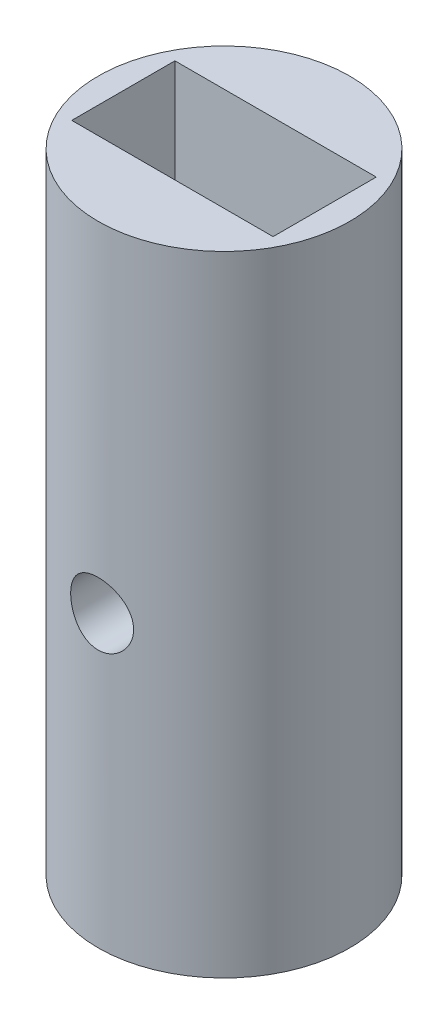
ISO-10303-21;
HEADER;
FILE_DESCRIPTION(('STEP AP214'),'2;1');
FILE_NAME('part.step','',(''),(''),'','','');
FILE_SCHEMA(('AUTOMOTIVE_DESIGN { 1 0 10303 214 1 1 1 1 }'));
ENDSEC;
DATA;
#1=APPLICATION_CONTEXT('core data for automotive mechanical design processes');
#2=APPLICATION_PROTOCOL_DEFINITION('international standard','automotive_design',2000,#1);
#3=PRODUCT_CONTEXT('',#1,'mechanical');
#4=PRODUCT('Part','Part','',(#3));
#5=PRODUCT_RELATED_PRODUCT_CATEGORY('part','',(#4));
#6=PRODUCT_DEFINITION_FORMATION('','',#4);
#7=PRODUCT_DEFINITION_CONTEXT('part definition',#1,'design');
#8=PRODUCT_DEFINITION('design','',#6,#7);
#9=PRODUCT_DEFINITION_SHAPE('','',#8);
#10=(LENGTH_UNIT() NAMED_UNIT(*) SI_UNIT(.MILLI.,.METRE.));
#11=(NAMED_UNIT(*) PLANE_ANGLE_UNIT() SI_UNIT($,.RADIAN.));
#12=(NAMED_UNIT(*) SI_UNIT($,.STERADIAN.) SOLID_ANGLE_UNIT());
#13=UNCERTAINTY_MEASURE_WITH_UNIT(LENGTH_MEASURE(1.E-05),#10,'distance_accuracy_value','');
#14=(GEOMETRIC_REPRESENTATION_CONTEXT(3) GLOBAL_UNCERTAINTY_ASSIGNED_CONTEXT((#13)) GLOBAL_UNIT_ASSIGNED_CONTEXT((#10,
#11,#12)) REPRESENTATION_CONTEXT('',''));
#15=CARTESIAN_POINT('',(0.,0.,0.));
#16=DIRECTION('',(0.,0.,1.));
#17=DIRECTION('',(1.,0.,0.));
#18=AXIS2_PLACEMENT_3D('',#15,#16,#17);
#19=CARTESIAN_POINT('',(0.,25.,0.));
#20=DIRECTION('',(0.,1.,0.));
#21=DIRECTION('',(0.,0.,-1.));
#22=AXIS2_PLACEMENT_3D('',#19,#20,#21);
#23=PLANE('',#22);
#24=CARTESIAN_POINT('',(0.,25.,0.));
#25=DIRECTION('',(0.,-1.,0.));
#26=DIRECTION('',(0.,0.,-1.));
#27=AXIS2_PLACEMENT_3D('',#24,#25,#26);
#28=CIRCLE('',#27,5.);
#29=CARTESIAN_POINT('',(0.,25.,-5.));
#30=VERTEX_POINT('',#29);
#31=EDGE_CURVE('E11',#30,#30,#28,.T.);
#32=ORIENTED_EDGE('',*,*,#31,.F.);
#33=EDGE_LOOP('',(#32));
#34=FACE_BOUND('',#33,.T.);
#35=DIRECTION('',(0.,0.,-1.));
#36=VECTOR('',#35,1.);
#37=CARTESIAN_POINT('',(-4.,25.,2.05));
#38=LINE('',#37,#36);
#39=CARTESIAN_POINT('',(-4.,25.,2.05));
#40=VERTEX_POINT('',#39);
#41=CARTESIAN_POINT('',(-4.,25.,-2.05));
#42=VERTEX_POINT('',#41);
#43=EDGE_CURVE('E99',#40,#42,#38,.T.);
#44=ORIENTED_EDGE('',*,*,#43,.T.);
#45=DIRECTION('',(-1.,0.,0.));
#46=VECTOR('',#45,1.);
#47=CARTESIAN_POINT('',(-4.,25.,-2.05));
#48=LINE('',#47,#46);
#49=CARTESIAN_POINT('',(4.,25.,-2.05));
#50=VERTEX_POINT('',#49);
#51=EDGE_CURVE('E98',#50,#42,#48,.T.);
#52=ORIENTED_EDGE('',*,*,#51,.F.);
#53=DIRECTION('',(0.,0.,-1.));
#54=VECTOR('',#53,1.);
#55=CARTESIAN_POINT('',(4.,25.,2.05));
#56=LINE('',#55,#54);
#57=CARTESIAN_POINT('',(4.,25.,2.05));
#58=VERTEX_POINT('',#57);
#59=EDGE_CURVE('E85',#58,#50,#56,.T.);
#60=ORIENTED_EDGE('',*,*,#59,.F.);
#61=DIRECTION('',(-1.,0.,0.));
#62=VECTOR('',#61,1.);
#63=CARTESIAN_POINT('',(-4.,25.,2.05));
#64=LINE('',#63,#62);
#65=EDGE_CURVE('E90',#58,#40,#64,.T.);
#66=ORIENTED_EDGE('',*,*,#65,.T.);
#67=EDGE_LOOP('',(#44,#52,#60,#66));
#68=FACE_BOUND('',#67,.T.);
#69=ADVANCED_FACE('F35',(#34,#68),#23,.T.);
#70=CARTESIAN_POINT('',(0.,25.,0.));
#71=DIRECTION('',(0.,-1.,0.));
#72=DIRECTION('',(0.,0.,1.));
#73=AXIS2_PLACEMENT_3D('',#70,#71,#72);
#74=CYLINDRICAL_SURFACE('',#73,5.);
#75=CARTESIAN_POINT('',(0.,12.7500000000011,5.));
#76=CARTESIAN_POINT('',(-0.0690634072247759,12.749998061886,4.99999883223344));
#77=CARTESIAN_POINT('',(-0.138148464858969,12.7442570410229,4.99855481776523));
#78=CARTESIAN_POINT('',(-0.274338603142109,12.7214790405786,4.99293428191577));
#79=CARTESIAN_POINT('',(-0.341442539058947,12.7044356587195,4.98875621183307));
#80=CARTESIAN_POINT('',(-0.471684060152144,12.6596339554493,4.97813021943367));
#81=CARTESIAN_POINT('',(-0.534826302858331,12.6318885010717,4.97168502368406));
#82=CARTESIAN_POINT('',(-0.655560109920348,12.566515508297,4.95721119839661));
#83=CARTESIAN_POINT('',(-0.71315148695729,12.5288876365686,4.94918251545042));
#84=CARTESIAN_POINT('',(-0.822334939417419,12.4439993419559,4.93222844659835));
#85=CARTESIAN_POINT('',(-0.87379640838421,12.3965736875351,4.92328922623778));
#86=CARTESIAN_POINT('',(-0.968124106002731,12.2937898292436,4.90561350097942));
#87=CARTESIAN_POINT('',(-1.01098936412425,12.238430730879,4.89687701906958));
#88=CARTESIAN_POINT('',(-1.08752211899916,12.1203373110532,4.88045646416426));
#89=CARTESIAN_POINT('',(-1.1210435132711,12.0575056409924,4.87278995392172));
#90=CARTESIAN_POINT('',(-1.17699742379207,11.9268763236191,4.8595791234352));
#91=CARTESIAN_POINT('',(-1.19943171286607,11.8590794722296,4.85403446393992));
#92=CARTESIAN_POINT('',(-1.23212903067019,11.7218804181656,4.8458373059796));
#93=CARTESIAN_POINT('',(-1.24262689027773,11.6525375866262,4.84312909229523));
#94=CARTESIAN_POINT('',(-1.25188481255648,11.5130261924894,4.84074468781452));
#95=CARTESIAN_POINT('',(-1.25064678484825,11.4428577660855,4.84106800373872));
#96=CARTESIAN_POINT('',(-1.23665543719933,11.3054868268806,4.84466004580517));
#97=CARTESIAN_POINT('',(-1.22418195015869,11.2382536487801,4.84785719168235));
#98=CARTESIAN_POINT('',(-1.18852015575251,11.1068657909083,4.85672258063738));
#99=CARTESIAN_POINT('',(-1.16533108505777,11.0427113308102,4.86239099975582));
#100=CARTESIAN_POINT('',(-1.10865789828087,10.9185516531243,4.87562594920158));
#101=CARTESIAN_POINT('',(-1.075072222694,10.8585948568431,4.8832110622452));
#102=CARTESIAN_POINT('',(-0.998630230012363,10.7450677418703,4.89941425705324));
#103=CARTESIAN_POINT('',(-0.955772290673931,10.6914985432783,4.90803251945615));
#104=CARTESIAN_POINT('',(-0.860552853900908,10.5906636535891,4.92563233783153));
#105=CARTESIAN_POINT('',(-0.807955215138107,10.5436212582833,4.93461724564978));
#106=CARTESIAN_POINT('',(-0.695509931252969,10.4589822979478,4.95171637982323));
#107=CARTESIAN_POINT('',(-0.635662064756503,10.4213860214481,4.95983057957848));
#108=CARTESIAN_POINT('',(-0.51009657390104,10.3566245114807,4.9743144341182));
#109=CARTESIAN_POINT('',(-0.444359494340399,10.329495549789,4.98067800106439));
#110=CARTESIAN_POINT('',(-0.309063340118946,10.2867355785764,4.99089930826183));
#111=CARTESIAN_POINT('',(-0.239504999291947,10.2711023696526,4.99475752782735));
#112=CARTESIAN_POINT('',(-0.100449975324899,10.2521186953687,4.99946249392812));
#113=CARTESIAN_POINT('',(-0.0309972666567185,10.2484641449383,5.00038377923566));
#114=CARTESIAN_POINT('',(0.107527395668045,10.252707501714,4.99932337345375));
#115=CARTESIAN_POINT('',(0.176599383037283,10.2606043690004,4.99734194368205));
#116=CARTESIAN_POINT('',(0.311345223980529,10.2874757569939,4.99074650939463));
#117=CARTESIAN_POINT('',(0.377054265807413,10.3062843862319,4.98617195154842));
#118=CARTESIAN_POINT('',(0.504381077043874,10.3542559033582,4.97490588861777));
#119=CARTESIAN_POINT('',(0.565998432527309,10.3834198369288,4.96821416974909));
#120=CARTESIAN_POINT('',(0.684602612024983,10.4518634407301,4.95327756605257));
#121=CARTESIAN_POINT('',(0.741487868196634,10.4913134269984,4.94500722805775));
#122=CARTESIAN_POINT('',(0.84793884470281,10.5789915906653,4.92787090989514));
#123=CARTESIAN_POINT('',(0.897503299144276,10.6272212830152,4.91900482709752));
#124=CARTESIAN_POINT('',(0.989158806727373,10.7325016340382,4.90140797467307));
#125=CARTESIAN_POINT('',(1.03103655635179,10.7897397525032,4.89268586822732));
#126=CARTESIAN_POINT('',(1.10459229917734,10.9106105287226,4.8766073198103));
#127=CARTESIAN_POINT('',(1.1362707451317,10.9742429024676,4.8692508172252));
#128=CARTESIAN_POINT('',(1.18829285050782,11.1057547686787,4.85681745612219));
#129=CARTESIAN_POINT('',(1.20870366387846,11.1736063569545,4.85172712743253));
#130=CARTESIAN_POINT('',(1.23778804996155,11.3119246982421,4.84438953408484));
#131=CARTESIAN_POINT('',(1.24646418956561,11.3823908758616,4.84214164766612));
#132=CARTESIAN_POINT('',(1.25169882527839,11.5217675198805,4.84079084336629));
#133=CARTESIAN_POINT('',(1.24859824815015,11.5906645292718,4.84159943940218));
#134=CARTESIAN_POINT('',(1.23114773192744,11.7269199072245,4.84606590839868));
#135=CARTESIAN_POINT('',(1.21679801890569,11.7942783066792,4.84972372409879));
#136=CARTESIAN_POINT('',(1.17744276620237,11.925173715889,4.85942717235601));
#137=CARTESIAN_POINT('',(1.15250117056702,11.9887310877013,4.86545846030257));
#138=CARTESIAN_POINT('',(1.09272076133759,12.1108044855959,4.8792312977069));
#139=CARTESIAN_POINT('',(1.05788057502852,12.1693198109902,4.88697308433977));
#140=CARTESIAN_POINT('',(0.978223123864302,12.2812955241695,4.90354695219593));
#141=CARTESIAN_POINT('',(0.933169302426898,12.3345842278544,4.91240220693131));
#142=CARTESIAN_POINT('',(0.834824475991461,12.432955870664,4.93006689371905));
#143=CARTESIAN_POINT('',(0.781531517717634,12.4780368584286,4.93887631439216));
#144=CARTESIAN_POINT('',(0.667056322252166,12.559509423805,4.95564713039719));
#145=CARTESIAN_POINT('',(0.605748685263662,12.5957288447274,4.9635902780489));
#146=CARTESIAN_POINT('',(0.477721716258732,12.6572895524516,4.97754104145932));
#147=CARTESIAN_POINT('',(0.41100630286395,12.6826386338749,4.98355004333151));
#148=CARTESIAN_POINT('',(0.287008544369559,12.7179765252758,4.99206716304618));
#149=CARTESIAN_POINT('',(0.230316809090056,12.7299593692123,4.99502154210576));
#150=CARTESIAN_POINT('',(0.115755059613569,12.745971619686,4.9989883769329));
#151=CARTESIAN_POINT('',(0.0578851343688464,12.7500016244222,5.00000097875745));
#152=CARTESIAN_POINT('',(0.,12.7500000000011,5.));
#153=B_SPLINE_CURVE_WITH_KNOTS('',3,(#75,#76,#77,#78,#79,#80,#81,#82,#83,#84,#85,#86,#87,#88,
#89,#90,#91,#92,#93,#94,#95,#96,#97,#98,#99,#100,#101,#102,#103,#104,#105,#106,#107,#108,#109,
#110,#111,#112,#113,#114,#115,#116,#117,#118,#119,#120,#121,#122,#123,#124,#125,#126,#127,#128,
#129,#130,#131,#132,#133,#134,#135,#136,#137,#138,#139,#140,#141,#142,#143,#144,#145,#146,#147,
#148,#149,#150,#151,#152),.UNSPECIFIED.,.T.,.F.,(4,2,2,2,2,2,2,2,2,2,2,2,2,2,2,2,2,2,2,2,2,2,2,
2,2,2,2,2,2,2,2,2,2,2,2,2,2,2,4),(0.,0.206978093726575,0.414073531469916,0.620920751905089,
0.827774950141107,1.03845362864283,1.24915607983385,1.46298872954839,1.6767871764114,
1.88630245916192,2.09578365093914,2.30018747505848,2.50460586221698,2.71108773228233,
2.91760575696802,3.13001250807516,3.34242574631873,3.55556857507595,3.76867061407202,
3.97631924124396,4.18394917593952,4.38850228761697,4.59307606101908,4.80127989637793,
5.00951969173349,5.2228709100373,5.4362126562459,5.6482687884503,5.8602785271034,
6.06619816998843,6.27211367463361,6.47680333799539,6.68152140114084,6.89157980341591,
7.10168808142014,7.3156015458299,7.52936136517791,7.7028520245179,7.87632963369199),.UNSPECIFIED.);
#154=CARTESIAN_POINT('',(0.,12.7500000000011,5.));
#155=VERTEX_POINT('',#154);
#156=EDGE_CURVE('E117',#155,#155,#153,.T.);
#157=ORIENTED_EDGE('',*,*,#156,.F.);
#158=EDGE_LOOP('',(#157));
#159=FACE_BOUND('',#158,.T.);
#160=CARTESIAN_POINT('',(1.25000000000006,11.5000000000011,-4.84122918275926));
#161=CARTESIAN_POINT('',(1.24999803929595,11.4309746245388,-4.84123050042653));
#162=CARTESIAN_POINT('',(1.24426312274871,11.3619275506621,-4.84272153006955));
#163=CARTESIAN_POINT('',(1.22151156273213,11.2258162109141,-4.84850930996623));
#164=CARTESIAN_POINT('',(1.20448835337116,11.1587531227669,-4.85280769310905));
#165=CARTESIAN_POINT('',(1.15974559981603,11.0285982309076,-4.86369362297982));
#166=CARTESIAN_POINT('',(1.13203986392729,10.9655014223083,-4.87027821345203));
#167=CARTESIAN_POINT('',(1.06676057063076,10.8448445737311,-4.88499096014403));
#168=CARTESIAN_POINT('',(1.0291865942804,10.787284768961,-4.8931191818925));
#169=CARTESIAN_POINT('',(0.944354213655997,10.67806917737,-4.91020358177805));
#170=CARTESIAN_POINT('',(0.896918443852084,10.6265531998261,-4.91917298811514));
#171=CARTESIAN_POINT('',(0.794091032050392,10.5321193028209,-4.93681437757648));
#172=CARTESIAN_POINT('',(0.738698647090214,10.4892021871902,-4.94548633283194));
#173=CARTESIAN_POINT('',(0.620572600539538,10.4126122661855,-4.9617020776029));
#174=CARTESIAN_POINT('',(0.557747288097621,10.3790768059204,-4.96922843700295));
#175=CARTESIAN_POINT('',(0.427131592146442,10.3230951779246,-4.98215405962991));
#176=CARTESIAN_POINT('',(0.35934194289603,10.3006473740433,-4.98755363667172));
#177=CARTESIAN_POINT('',(0.222179379377141,10.2679260827118,-4.9955237942409));
#178=CARTESIAN_POINT('',(0.152866359774548,10.2574151778378,-4.99814946922157));
#179=CARTESIAN_POINT('',(0.013414409631444,10.2481208103633,-5.00046797053649));
#180=CARTESIAN_POINT('',(-0.0567243972689752,10.2493356138963,-5.00016123048352));
#181=CARTESIAN_POINT('',(-0.194190308965426,10.2632874251262,-4.99669047476768));
#182=CARTESIAN_POINT('',(-0.261545269501275,10.275768162528,-4.99359001170437));
#183=CARTESIAN_POINT('',(-0.393172809267049,10.3114856350253,-4.98495418262427));
#184=CARTESIAN_POINT('',(-0.457445224212989,10.3347229426898,-4.97941868699221));
#185=CARTESIAN_POINT('',(-0.5817583793772,10.3915012853446,-4.96643754850448));
#186=CARTESIAN_POINT('',(-0.641755637208072,10.425133522332,-4.95897509847527));
#187=CARTESIAN_POINT('',(-0.755344527925552,10.5016778395592,-4.94294951904825));
#188=CARTESIAN_POINT('',(-0.808935043856823,10.5445915342814,-4.93438619826246));
#189=CARTESIAN_POINT('',(-0.909717543856135,10.6398543709923,-4.91681856884761));
#190=CARTESIAN_POINT('',(-0.956697098843938,10.692427446175,-4.9078085976296));
#191=CARTESIAN_POINT('',(-1.04122046995371,10.8047999867712,-4.89057521758355));
#192=CARTESIAN_POINT('',(-1.07876384505746,10.8645997897466,-4.88235184552987));
#193=CARTESIAN_POINT('',(-1.14348516127819,10.9901450170756,-4.86760248415826));
#194=CARTESIAN_POINT('',(-1.17061195871305,11.0559178651577,-4.86108491862862));
#195=CARTESIAN_POINT('',(-1.21335702579536,11.1912927340393,-4.8505932006998));
#196=CARTESIAN_POINT('',(-1.22897775819108,11.2608939319927,-4.84661850405111));
#197=CARTESIAN_POINT('',(-1.24791481933253,11.3999797507627,-4.84177678019572));
#198=CARTESIAN_POINT('',(-1.25154523695975,11.4694188966659,-4.84083044546826));
#199=CARTESIAN_POINT('',(-1.24725849525771,11.6079109682902,-4.84193671740521));
#200=CARTESIAN_POINT('',(-1.23934239892434,11.6769639289767,-4.84398904800635));
#201=CARTESIAN_POINT('',(-1.21246273196877,11.8115571324784,-4.85078540977282));
#202=CARTESIAN_POINT('',(-1.19368203414081,11.8771363632865,-4.85548485117189));
#203=CARTESIAN_POINT('',(-1.14580904083525,12.0042157289269,-4.86700359135483));
#204=CARTESIAN_POINT('',(-1.11671552385621,12.0657153795288,-4.87382314124308));
#205=CARTESIAN_POINT('',(-1.04838533396822,12.1842206389348,-4.88898068546633));
#206=CARTESIAN_POINT('',(-1.00896087691775,12.2411144200226,-4.89734584303322));
#207=CARTESIAN_POINT('',(-0.921325366168008,12.3475941814018,-4.91458541535859));
#208=CARTESIAN_POINT('',(-0.873112868506737,12.3971789583261,-4.92345991364236));
#209=CARTESIAN_POINT('',(-0.767828401230844,12.4889055212866,-4.94098701515804));
#210=CARTESIAN_POINT('',(-0.710564940664427,12.5308300312755,-4.94962851030919));
#211=CARTESIAN_POINT('',(-0.58962835336828,12.6044679334767,-4.96548608306868));
#212=CARTESIAN_POINT('',(-0.525955561196924,12.6361818583052,-4.97270223501981));
#213=CARTESIAN_POINT('',(-0.394447752163798,12.6882230172651,-4.98485057869157));
#214=CARTESIAN_POINT('',(-0.326646726284787,12.7086321421906,-4.98979915011205));
#215=CARTESIAN_POINT('',(-0.188437200398446,12.7377301673053,-4.99692646697894));
#216=CARTESIAN_POINT('',(-0.118029206301491,12.7464213293706,-4.99910574696704));
#217=CARTESIAN_POINT('',(0.0213544080542203,12.7517094869705,-5.00042711761014));
#218=CARTESIAN_POINT('',(0.0903172837076036,12.7486271363703,-4.9996497360001));
#219=CARTESIAN_POINT('',(0.226709370518486,12.7311902158832,-4.99532370571779));
#220=CARTESIAN_POINT('',(0.29413862722617,12.7168359812347,-4.99177513946368));
#221=CARTESIAN_POINT('',(0.425213794556082,12.6774347252874,-4.98231791067453));
#222=CARTESIAN_POINT('',(0.488878118226335,12.6524456833578,-4.97642205628332));
#223=CARTESIAN_POINT('',(0.611146316301897,12.5925367762269,-4.96289111141729));
#224=CARTESIAN_POINT('',(0.669749551581375,12.5576156591641,-4.95525580172169));
#225=CARTESIAN_POINT('',(0.781752410529935,12.4778559575047,-4.93884062101665));
#226=CARTESIAN_POINT('',(0.834993735375791,12.4327998213669,-4.93003771182013));
#227=CARTESIAN_POINT('',(0.93326877533913,12.3344714350338,-4.91238311316551));
#228=CARTESIAN_POINT('',(0.978300406335297,12.2811971048787,-4.90353141190694));
#229=CARTESIAN_POINT('',(1.0597025330991,12.1667482322494,-4.88659344825684));
#230=CARTESIAN_POINT('',(1.09589577430825,12.1054448457353,-4.87852454662354));
#231=CARTESIAN_POINT('',(1.15740862076964,11.9774306375977,-4.86429944438268));
#232=CARTESIAN_POINT('',(1.18273613719971,11.9107237923677,-4.85814185308377));
#233=CARTESIAN_POINT('',(1.21802816070686,11.7867787352177,-4.84939885924728));
#234=CARTESIAN_POINT('',(1.22999146324428,11.7301335445213,-4.84635828750682));
#235=CARTESIAN_POINT('',(1.24597786571664,11.6156639137511,-4.84227298231964));
#236=CARTESIAN_POINT('',(1.25000164296529,11.5578395746948,-4.84122807862452));
#237=CARTESIAN_POINT('',(1.25000000000006,11.5000000000011,-4.84122918275926));
#238=B_SPLINE_CURVE_WITH_KNOTS('',3,(#160,#161,#162,#163,#164,#165,#166,#167,#168,#169,#170,
#171,#172,#173,#174,#175,#176,#177,#178,#179,#180,#181,#182,#183,#184,#185,#186,#187,#188,#189,
#190,#191,#192,#193,#194,#195,#196,#197,#198,#199,#200,#201,#202,#203,#204,#205,#206,#207,#208,
#209,#210,#211,#212,#213,#214,#215,#216,#217,#218,#219,#220,#221,#222,#223,#224,#225,#226,#227,
#228,#229,#230,#231,#232,#233,#234,#235,#236,#237),.UNSPECIFIED.,.T.,.F.,(4,2,2,2,2,2,2,2,2,2,2,
2,2,2,2,2,2,2,2,2,2,2,2,2,2,2,2,2,2,2,2,2,2,2,2,2,2,2,4),(0.,0.206863720868071,
0.413847870714333,0.620565363583013,0.827291633777391,1.03811977096488,1.24896760739933,
1.4627574819896,1.67651579923546,1.88594375497673,2.0953407433301,2.30009131344474,
2.50485278362393,2.71146437127222,2.91811192734457,3.13035233285955,3.34260265599901,
3.55588216004201,3.76911600064773,3.97671787380858,4.18430063591901,4.38848702504603,
4.59269760710709,4.80091422929578,5.00916509442522,5.22262665482659,5.43607707859777,
5.64796036403464,5.85980274454519,6.06591723063728,6.2720255868849,6.47702438279855,
6.68204902869036,6.89198548291035,7.10197515782754,7.31588238642338,7.52963360683309,
7.70298913588664,7.8763298754976),.UNSPECIFIED.);
#239=CARTESIAN_POINT('',(1.25000000000006,11.5000000000011,-4.84122918275926));
#240=VERTEX_POINT('',#239);
#241=EDGE_CURVE('E126',#240,#240,#238,.T.);
#242=ORIENTED_EDGE('',*,*,#241,.F.);
#243=EDGE_LOOP('',(#242));
#244=FACE_BOUND('',#243,.T.);
#245=ORIENTED_EDGE('',*,*,#31,.T.);
#246=EDGE_LOOP('',(#245));
#247=FACE_BOUND('',#246,.T.);
#248=CARTESIAN_POINT('',(0.,0.,0.));
#249=DIRECTION('',(0.,-1.,0.));
#250=DIRECTION('',(0.,0.,-1.));
#251=AXIS2_PLACEMENT_3D('',#248,#249,#250);
#252=CIRCLE('',#251,5.);
#253=CARTESIAN_POINT('',(0.,0.,-5.));
#254=VERTEX_POINT('',#253);
#255=EDGE_CURVE('E45',#254,#254,#252,.T.);
#256=ORIENTED_EDGE('',*,*,#255,.F.);
#257=EDGE_LOOP('',(#256));
#258=FACE_BOUND('',#257,.T.);
#259=ADVANCED_FACE('F37',(#159,#244,#247,#258),#74,.T.);
#260=CARTESIAN_POINT('',(0.,0.,0.));
#261=DIRECTION('',(0.,1.,0.));
#262=DIRECTION('',(0.,0.,-1.));
#263=AXIS2_PLACEMENT_3D('',#260,#261,#262);
#264=PLANE('',#263);
#265=ORIENTED_EDGE('',*,*,#255,.T.);
#266=EDGE_LOOP('',(#265));
#267=FACE_BOUND('',#266,.T.);
#268=ADVANCED_FACE('F153',(#267),#264,.F.);
#269=CARTESIAN_POINT('',(0.,11.5,2.05));
#270=DIRECTION('',(0.,0.,-1.));
#271=DIRECTION('',(1.,0.,0.));
#272=AXIS2_PLACEMENT_3D('',#269,#270,#271);
#273=CYLINDRICAL_SURFACE('',#272,4.);
#274=CARTESIAN_POINT('',(0.,11.5,-2.05));
#275=DIRECTION('',(0.,0.,1.));
#276=DIRECTION('',(1.,0.,0.));
#277=AXIS2_PLACEMENT_3D('',#274,#275,#276);
#278=CIRCLE('',#277,4.);
#279=CARTESIAN_POINT('',(-4.,11.5,-2.05));
#280=VERTEX_POINT('',#279);
#281=CARTESIAN_POINT('',(4.,11.5,-2.05));
#282=VERTEX_POINT('',#281);
#283=EDGE_CURVE('E115',#280,#282,#278,.T.);
#284=ORIENTED_EDGE('',*,*,#283,.F.);
#285=DIRECTION('',(0.,0.,-1.));
#286=VECTOR('',#285,1.);
#287=CARTESIAN_POINT('',(-4.,11.5,2.05));
#288=LINE('',#287,#286);
#289=CARTESIAN_POINT('',(-4.,11.5,2.05));
#290=VERTEX_POINT('',#289);
#291=EDGE_CURVE('E101',#290,#280,#288,.T.);
#292=ORIENTED_EDGE('',*,*,#291,.F.);
#293=CARTESIAN_POINT('',(0.,11.5,2.05));
#294=DIRECTION('',(0.,0.,1.));
#295=DIRECTION('',(1.,0.,0.));
#296=AXIS2_PLACEMENT_3D('',#293,#294,#295);
#297=CIRCLE('',#296,4.);
#298=CARTESIAN_POINT('',(4.,11.5,2.05));
#299=VERTEX_POINT('',#298);
#300=EDGE_CURVE('E91',#290,#299,#297,.T.);
#301=ORIENTED_EDGE('',*,*,#300,.T.);
#302=DIRECTION('',(0.,0.,-1.));
#303=VECTOR('',#302,1.);
#304=CARTESIAN_POINT('',(4.,11.5,2.05));
#305=LINE('',#304,#303);
#306=EDGE_CURVE('E88',#299,#282,#305,.T.);
#307=ORIENTED_EDGE('',*,*,#306,.T.);
#308=EDGE_LOOP('',(#284,#292,#301,#307));
#309=FACE_BOUND('',#308,.T.);
#310=ADVANCED_FACE('F148',(#309),#273,.F.);
#311=CARTESIAN_POINT('',(-4.,11.5,2.05));
#312=DIRECTION('',(-1.,0.,0.));
#313=DIRECTION('',(0.,0.,-1.));
#314=AXIS2_PLACEMENT_3D('',#311,#312,#313);
#315=PLANE('',#314);
#316=DIRECTION('',(0.,-1.,0.));
#317=VECTOR('',#316,1.);
#318=CARTESIAN_POINT('',(-4.,11.5,-2.05));
#319=LINE('',#318,#317);
#320=EDGE_CURVE('E53',#42,#280,#319,.T.);
#321=ORIENTED_EDGE('',*,*,#320,.F.);
#322=ORIENTED_EDGE('',*,*,#43,.F.);
#323=DIRECTION('',(0.,-1.,0.));
#324=VECTOR('',#323,1.);
#325=CARTESIAN_POINT('',(-4.,11.5,2.05));
#326=LINE('',#325,#324);
#327=EDGE_CURVE('E59',#40,#290,#326,.T.);
#328=ORIENTED_EDGE('',*,*,#327,.T.);
#329=ORIENTED_EDGE('',*,*,#291,.T.);
#330=EDGE_LOOP('',(#321,#322,#328,#329));
#331=FACE_BOUND('',#330,.T.);
#332=ADVANCED_FACE('F145',(#331),#315,.F.);
#333=CARTESIAN_POINT('',(4.,11.5,2.05));
#334=DIRECTION('',(1.,0.,0.));
#335=DIRECTION('',(0.,0.,1.));
#336=AXIS2_PLACEMENT_3D('',#333,#334,#335);
#337=PLANE('',#336);
#338=DIRECTION('',(0.,1.,0.));
#339=VECTOR('',#338,1.);
#340=CARTESIAN_POINT('',(4.,11.5,-2.05));
#341=LINE('',#340,#339);
#342=EDGE_CURVE('E113',#282,#50,#341,.T.);
#343=ORIENTED_EDGE('',*,*,#342,.F.);
#344=ORIENTED_EDGE('',*,*,#306,.F.);
#345=DIRECTION('',(0.,1.,0.));
#346=VECTOR('',#345,1.);
#347=CARTESIAN_POINT('',(4.,11.5,2.05));
#348=LINE('',#347,#346);
#349=EDGE_CURVE('E79',#299,#58,#348,.T.);
#350=ORIENTED_EDGE('',*,*,#349,.T.);
#351=ORIENTED_EDGE('',*,*,#59,.T.);
#352=EDGE_LOOP('',(#343,#344,#350,#351));
#353=FACE_BOUND('',#352,.T.);
#354=ADVANCED_FACE('F83',(#353),#337,.F.);
#355=CARTESIAN_POINT('',(0.,11.5,2.05));
#356=DIRECTION('',(0.,0.,-1.));
#357=DIRECTION('',(1.,0.,0.));
#358=AXIS2_PLACEMENT_3D('',#355,#356,#357);
#359=PLANE('',#358);
#360=CARTESIAN_POINT('',(0.,11.5000000000011,2.05));
#361=DIRECTION('',(0.,0.,1.));
#362=DIRECTION('',(1.,0.,0.));
#363=AXIS2_PLACEMENT_3D('',#360,#361,#362);
#364=CIRCLE('',#363,1.25);
#365=CARTESIAN_POINT('',(1.25000000000006,11.5000000000011,2.05));
#366=VERTEX_POINT('',#365);
#367=EDGE_CURVE('E172',#366,#366,#364,.T.);
#368=ORIENTED_EDGE('',*,*,#367,.T.);
#369=EDGE_LOOP('',(#368));
#370=FACE_BOUND('',#369,.T.);
#371=ORIENTED_EDGE('',*,*,#300,.F.);
#372=ORIENTED_EDGE('',*,*,#327,.F.);
#373=ORIENTED_EDGE('',*,*,#65,.F.);
#374=ORIENTED_EDGE('',*,*,#349,.F.);
#375=EDGE_LOOP('',(#371,#372,#373,#374));
#376=FACE_BOUND('',#375,.T.);
#377=ADVANCED_FACE('F94',(#370,#376),#359,.T.);
#378=CARTESIAN_POINT('',(0.,11.5,-2.05));
#379=DIRECTION('',(0.,0.,-1.));
#380=DIRECTION('',(1.,0.,0.));
#381=AXIS2_PLACEMENT_3D('',#378,#379,#380);
#382=PLANE('',#381);
#383=CARTESIAN_POINT('',(0.,11.5000000000011,-2.05));
#384=DIRECTION('',(0.,0.,1.));
#385=DIRECTION('',(1.,0.,0.));
#386=AXIS2_PLACEMENT_3D('',#383,#384,#385);
#387=CIRCLE('',#386,1.25);
#388=CARTESIAN_POINT('',(1.25000000000006,11.5000000000011,-2.05));
#389=VERTEX_POINT('',#388);
#390=EDGE_CURVE('E40',#389,#389,#387,.T.);
#391=ORIENTED_EDGE('',*,*,#390,.F.);
#392=EDGE_LOOP('',(#391));
#393=FACE_BOUND('',#392,.T.);
#394=ORIENTED_EDGE('',*,*,#283,.T.);
#395=ORIENTED_EDGE('',*,*,#342,.T.);
#396=ORIENTED_EDGE('',*,*,#51,.T.);
#397=ORIENTED_EDGE('',*,*,#320,.T.);
#398=EDGE_LOOP('',(#394,#395,#396,#397));
#399=FACE_BOUND('',#398,.T.);
#400=ADVANCED_FACE('F140',(#393,#399),#382,.F.);
#401=CARTESIAN_POINT('',(0.,11.5000000000011,5.));
#402=DIRECTION('',(0.,0.,-1.));
#403=DIRECTION('',(1.,0.,0.));
#404=AXIS2_PLACEMENT_3D('',#401,#402,#403);
#405=CYLINDRICAL_SURFACE('',#404,1.25);
#406=ORIENTED_EDGE('',*,*,#390,.T.);
#407=EDGE_LOOP('',(#406));
#408=FACE_BOUND('',#407,.T.);
#409=ORIENTED_EDGE('',*,*,#241,.T.);
#410=EDGE_LOOP('',(#409));
#411=FACE_BOUND('',#410,.T.);
#412=ADVANCED_FACE('F135',(#408,#411),#405,.F.);
#413=ORIENTED_EDGE('',*,*,#367,.F.);
#414=EDGE_LOOP('',(#413));
#415=FACE_BOUND('',#414,.T.);
#416=ORIENTED_EDGE('',*,*,#156,.T.);
#417=EDGE_LOOP('',(#416));
#418=FACE_BOUND('',#417,.T.);
#419=ADVANCED_FACE('F131',(#415,#418),#405,.F.);
#420=CLOSED_SHELL('',(#69,#259,#268,#310,#332,#354,#377,#400,#412,#419));
#421=MANIFOLD_SOLID_BREP('B2',#420);
#422=ADVANCED_BREP_SHAPE_REPRESENTATION('',(#18,#421),#14);
#423=SHAPE_DEFINITION_REPRESENTATION(#9,#422);
ENDSEC;
END-ISO-10303-21;
